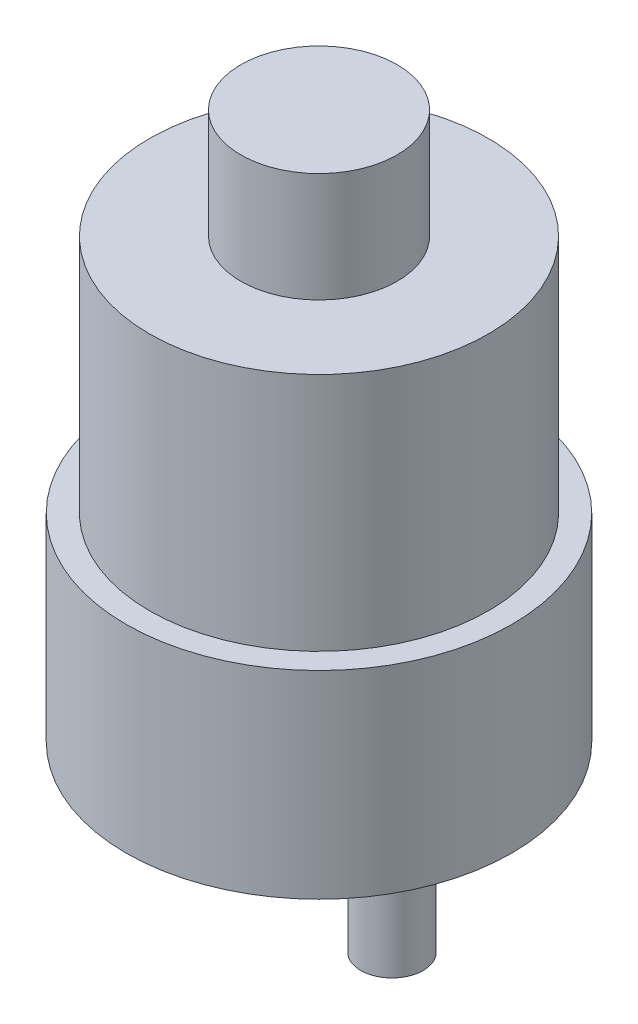
ISO-10303-21;
HEADER;
FILE_DESCRIPTION(('STEP AP214'),'2;1');
FILE_NAME('part.step','',(''),(''),'','','');
FILE_SCHEMA(('AUTOMOTIVE_DESIGN { 1 0 10303 214 1 1 1 1 }'));
ENDSEC;
DATA;
#1=APPLICATION_CONTEXT('core data for automotive mechanical design processes');
#2=APPLICATION_PROTOCOL_DEFINITION('international standard','automotive_design',2000,#1);
#3=PRODUCT_CONTEXT('',#1,'mechanical');
#4=PRODUCT('Part','Part','',(#3));
#5=PRODUCT_RELATED_PRODUCT_CATEGORY('part','',(#4));
#6=PRODUCT_DEFINITION_FORMATION('','',#4);
#7=PRODUCT_DEFINITION_CONTEXT('part definition',#1,'design');
#8=PRODUCT_DEFINITION('design','',#6,#7);
#9=PRODUCT_DEFINITION_SHAPE('','',#8);
#10=(LENGTH_UNIT() NAMED_UNIT(*) SI_UNIT(.MILLI.,.METRE.));
#11=(NAMED_UNIT(*) PLANE_ANGLE_UNIT() SI_UNIT($,.RADIAN.));
#12=(NAMED_UNIT(*) SI_UNIT($,.STERADIAN.) SOLID_ANGLE_UNIT());
#13=UNCERTAINTY_MEASURE_WITH_UNIT(LENGTH_MEASURE(1.E-05),#10,'distance_accuracy_value','');
#14=(GEOMETRIC_REPRESENTATION_CONTEXT(3) GLOBAL_UNCERTAINTY_ASSIGNED_CONTEXT((#13)) GLOBAL_UNIT_ASSIGNED_CONTEXT((#10,
#11,#12)) REPRESENTATION_CONTEXT('',''));
#15=CARTESIAN_POINT('',(0.,0.,0.));
#16=DIRECTION('',(0.,0.,1.));
#17=DIRECTION('',(1.,0.,0.));
#18=AXIS2_PLACEMENT_3D('',#15,#16,#17);
#19=CARTESIAN_POINT('',(0.,19.,0.));
#20=DIRECTION('',(0.,-1.,0.));
#21=DIRECTION('',(0.,0.,-1.));
#22=AXIS2_PLACEMENT_3D('',#19,#20,#21);
#23=CYLINDRICAL_SURFACE('',#22,18.5);
#24=CARTESIAN_POINT('',(0.,19.,0.));
#25=DIRECTION('',(0.,1.,0.));
#26=DIRECTION('',(0.,0.,1.));
#27=AXIS2_PLACEMENT_3D('',#24,#25,#26);
#28=CIRCLE('',#27,18.5);
#29=CARTESIAN_POINT('',(0.,19.,18.5));
#30=VERTEX_POINT('',#29);
#31=EDGE_CURVE('E95',#30,#30,#28,.T.);
#32=ORIENTED_EDGE('',*,*,#31,.F.);
#33=EDGE_LOOP('',(#32));
#34=FACE_BOUND('',#33,.T.);
#35=CARTESIAN_POINT('',(0.,0.,0.));
#36=DIRECTION('',(0.,1.,0.));
#37=DIRECTION('',(0.,0.,1.));
#38=AXIS2_PLACEMENT_3D('',#35,#36,#37);
#39=CIRCLE('',#38,18.5);
#40=CARTESIAN_POINT('',(0.,0.,18.5));
#41=VERTEX_POINT('',#40);
#42=EDGE_CURVE('E92',#41,#41,#39,.T.);
#43=ORIENTED_EDGE('',*,*,#42,.T.);
#44=EDGE_LOOP('',(#43));
#45=FACE_BOUND('',#44,.T.);
#46=ADVANCED_FACE('F37',(#34,#45),#23,.T.);
#47=CARTESIAN_POINT('',(0.,19.,0.));
#48=DIRECTION('',(0.,1.,0.));
#49=DIRECTION('',(0.,0.,1.));
#50=AXIS2_PLACEMENT_3D('',#47,#48,#49);
#51=PLANE('',#50);
#52=CARTESIAN_POINT('',(0.,19.,0.));
#53=DIRECTION('',(0.,1.,0.));
#54=DIRECTION('',(0.,0.,1.));
#55=AXIS2_PLACEMENT_3D('',#52,#53,#54);
#56=CIRCLE('',#55,16.25);
#57=CARTESIAN_POINT('',(0.,19.,16.25));
#58=VERTEX_POINT('',#57);
#59=EDGE_CURVE('E45',#58,#58,#56,.T.);
#60=ORIENTED_EDGE('',*,*,#59,.F.);
#61=EDGE_LOOP('',(#60));
#62=FACE_BOUND('',#61,.T.);
#63=ORIENTED_EDGE('',*,*,#31,.T.);
#64=EDGE_LOOP('',(#63));
#65=FACE_BOUND('',#64,.T.);
#66=ADVANCED_FACE('F156',(#62,#65),#51,.T.);
#67=CARTESIAN_POINT('',(0.,0.,0.));
#68=DIRECTION('',(0.,1.,0.));
#69=DIRECTION('',(0.,0.,1.));
#70=AXIS2_PLACEMENT_3D('',#67,#68,#69);
#71=PLANE('',#70);
#72=CARTESIAN_POINT('',(15.5,0.,0.));
#73=DIRECTION('',(0.,1.,0.));
#74=DIRECTION('',(0.,0.,1.));
#75=AXIS2_PLACEMENT_3D('',#72,#73,#74);
#76=CIRCLE('',#75,1.36510364534446);
#77=CARTESIAN_POINT('',(15.5,0.,1.36510364534446));
#78=VERTEX_POINT('',#77);
#79=EDGE_CURVE('E81',#78,#78,#76,.T.);
#80=ORIENTED_EDGE('',*,*,#79,.T.);
#81=EDGE_LOOP('',(#80));
#82=FACE_BOUND('',#81,.T.);
#83=CARTESIAN_POINT('',(7.75,0.,-13.4233937586588));
#84=DIRECTION('',(0.,1.,0.));
#85=DIRECTION('',(0.,0.,1.));
#86=AXIS2_PLACEMENT_3D('',#83,#84,#85);
#87=CIRCLE('',#86,1.36510364534446);
#88=CARTESIAN_POINT('',(7.75,0.,-12.0582901133143));
#89=VERTEX_POINT('',#88);
#90=EDGE_CURVE('E109',#89,#89,#87,.T.);
#91=ORIENTED_EDGE('',*,*,#90,.T.);
#92=EDGE_LOOP('',(#91));
#93=FACE_BOUND('',#92,.T.);
#94=CARTESIAN_POINT('',(-7.75,0.,-13.4233937586588));
#95=DIRECTION('',(0.,1.,0.));
#96=DIRECTION('',(0.,0.,1.));
#97=AXIS2_PLACEMENT_3D('',#94,#95,#96);
#98=CIRCLE('',#97,1.36510364534446);
#99=CARTESIAN_POINT('',(-7.75,0.,-12.0582901133143));
#100=VERTEX_POINT('',#99);
#101=EDGE_CURVE('E131',#100,#100,#98,.T.);
#102=ORIENTED_EDGE('',*,*,#101,.T.);
#103=EDGE_LOOP('',(#102));
#104=FACE_BOUND('',#103,.T.);
#105=CARTESIAN_POINT('',(-15.5,0.,0.));
#106=DIRECTION('',(0.,1.,0.));
#107=DIRECTION('',(0.,0.,1.));
#108=AXIS2_PLACEMENT_3D('',#105,#106,#107);
#109=CIRCLE('',#108,1.36510364534447);
#110=CARTESIAN_POINT('',(-15.5,0.,1.36510364534447));
#111=VERTEX_POINT('',#110);
#112=EDGE_CURVE('E126',#111,#111,#109,.T.);
#113=ORIENTED_EDGE('',*,*,#112,.T.);
#114=EDGE_LOOP('',(#113));
#115=FACE_BOUND('',#114,.T.);
#116=CARTESIAN_POINT('',(-7.74999999999999,0.,13.4233937586588));
#117=DIRECTION('',(0.,1.,0.));
#118=DIRECTION('',(0.,0.,1.));
#119=AXIS2_PLACEMENT_3D('',#116,#117,#118);
#120=CIRCLE('',#119,1.36510364534447);
#121=CARTESIAN_POINT('',(-7.74999999999999,0.,14.7884974040033));
#122=VERTEX_POINT('',#121);
#123=EDGE_CURVE('E120',#122,#122,#120,.T.);
#124=ORIENTED_EDGE('',*,*,#123,.T.);
#125=EDGE_LOOP('',(#124));
#126=FACE_BOUND('',#125,.T.);
#127=CARTESIAN_POINT('',(7.75000000000001,0.,13.4233937586588));
#128=DIRECTION('',(0.,1.,0.));
#129=DIRECTION('',(0.,0.,1.));
#130=AXIS2_PLACEMENT_3D('',#127,#128,#129);
#131=CIRCLE('',#130,1.36510364534447);
#132=CARTESIAN_POINT('',(7.75000000000001,0.,14.7884974040033));
#133=VERTEX_POINT('',#132);
#134=EDGE_CURVE('E108',#133,#133,#131,.T.);
#135=ORIENTED_EDGE('',*,*,#134,.T.);
#136=EDGE_LOOP('',(#135));
#137=FACE_BOUND('',#136,.T.);
#138=CARTESIAN_POINT('',(0.,0.,-7.));
#139=DIRECTION('',(0.,1.,0.));
#140=DIRECTION('',(0.,0.,1.));
#141=AXIS2_PLACEMENT_3D('',#138,#139,#140);
#142=CIRCLE('',#141,6.);
#143=CARTESIAN_POINT('',(0.,0.,-0.999999999999999));
#144=VERTEX_POINT('',#143);
#145=EDGE_CURVE('E87',#144,#144,#142,.T.);
#146=ORIENTED_EDGE('',*,*,#145,.T.);
#147=EDGE_LOOP('',(#146));
#148=FACE_BOUND('',#147,.T.);
#149=ORIENTED_EDGE('',*,*,#42,.F.);
#150=EDGE_LOOP('',(#149));
#151=FACE_BOUND('',#150,.T.);
#152=ADVANCED_FACE('F161',(#82,#93,#104,#115,#126,#137,#148,#151),#71,.F.);
#153=CARTESIAN_POINT('',(0.,-6.,-7.));
#154=DIRECTION('',(0.,1.,0.));
#155=DIRECTION('',(0.,0.,1.));
#156=AXIS2_PLACEMENT_3D('',#153,#154,#155);
#157=CYLINDRICAL_SURFACE('',#156,6.);
#158=CARTESIAN_POINT('',(0.,-6.,-7.));
#159=DIRECTION('',(0.,1.,0.));
#160=DIRECTION('',(0.,0.,1.));
#161=AXIS2_PLACEMENT_3D('',#158,#159,#160);
#162=CIRCLE('',#161,6.);
#163=CARTESIAN_POINT('',(0.,-6.,-0.999999999999999));
#164=VERTEX_POINT('',#163);
#165=EDGE_CURVE('E89',#164,#164,#162,.T.);
#166=ORIENTED_EDGE('',*,*,#165,.T.);
#167=EDGE_LOOP('',(#166));
#168=FACE_BOUND('',#167,.T.);
#169=ORIENTED_EDGE('',*,*,#145,.F.);
#170=EDGE_LOOP('',(#169));
#171=FACE_BOUND('',#170,.T.);
#172=ADVANCED_FACE('F169',(#168,#171),#157,.T.);
#173=CARTESIAN_POINT('',(0.,-6.,0.));
#174=DIRECTION('',(0.,1.,0.));
#175=DIRECTION('',(0.,0.,1.));
#176=AXIS2_PLACEMENT_3D('',#173,#174,#175);
#177=PLANE('',#176);
#178=DIRECTION('',(1.,0.,0.));
#179=VECTOR('',#178,1.);
#180=CARTESIAN_POINT('',(0.,-6.,-9.));
#181=LINE('',#180,#179);
#182=CARTESIAN_POINT('',(-2.23606797749979,-6.,-9.));
#183=VERTEX_POINT('',#182);
#184=CARTESIAN_POINT('',(2.23606797749979,-6.,-9.));
#185=VERTEX_POINT('',#184);
#186=EDGE_CURVE('E52',#183,#185,#181,.T.);
#187=ORIENTED_EDGE('',*,*,#186,.F.);
#188=CARTESIAN_POINT('',(0.,-6.,-7.));
#189=DIRECTION('',(0.,1.,0.));
#190=DIRECTION('',(0.,0.,1.));
#191=AXIS2_PLACEMENT_3D('',#188,#189,#190);
#192=CIRCLE('',#191,3.);
#193=EDGE_CURVE('E40',#183,#185,#192,.T.);
#194=ORIENTED_EDGE('',*,*,#193,.T.);
#195=EDGE_LOOP('',(#187,#194));
#196=FACE_BOUND('',#195,.T.);
#197=ORIENTED_EDGE('',*,*,#165,.F.);
#198=EDGE_LOOP('',(#197));
#199=FACE_BOUND('',#198,.T.);
#200=ADVANCED_FACE('F174',(#196,#199),#177,.F.);
#201=CARTESIAN_POINT('',(0.,-21.,-7.));
#202=DIRECTION('',(0.,1.,0.));
#203=DIRECTION('',(0.,0.,1.));
#204=AXIS2_PLACEMENT_3D('',#201,#202,#203);
#205=CYLINDRICAL_SURFACE('',#204,3.);
#206=ORIENTED_EDGE('',*,*,#193,.F.);
#207=DIRECTION('',(0.,1.,0.));
#208=VECTOR('',#207,1.);
#209=CARTESIAN_POINT('',(-2.23606797749979,-21.,-9.));
#210=LINE('',#209,#208);
#211=CARTESIAN_POINT('',(-2.23606797749979,-21.,-9.));
#212=VERTEX_POINT('',#211);
#213=EDGE_CURVE('E75',#212,#183,#210,.T.);
#214=ORIENTED_EDGE('',*,*,#213,.F.);
#215=CARTESIAN_POINT('',(0.,-21.,-7.));
#216=DIRECTION('',(0.,1.,0.));
#217=DIRECTION('',(0.,0.,1.));
#218=AXIS2_PLACEMENT_3D('',#215,#216,#217);
#219=CIRCLE('',#218,3.);
#220=CARTESIAN_POINT('',(2.23606797749979,-21.,-9.));
#221=VERTEX_POINT('',#220);
#222=EDGE_CURVE('E67',#212,#221,#219,.T.);
#223=ORIENTED_EDGE('',*,*,#222,.T.);
#224=DIRECTION('',(0.,1.,0.));
#225=VECTOR('',#224,1.);
#226=CARTESIAN_POINT('',(2.23606797749979,-21.,-9.));
#227=LINE('',#226,#225);
#228=EDGE_CURVE('E70',#221,#185,#227,.T.);
#229=ORIENTED_EDGE('',*,*,#228,.T.);
#230=EDGE_LOOP('',(#206,#214,#223,#229));
#231=FACE_BOUND('',#230,.T.);
#232=ADVANCED_FACE('F77',(#231),#205,.T.);
#233=CARTESIAN_POINT('',(-2.23606797749979,-21.,-9.));
#234=DIRECTION('',(0.,0.,1.));
#235=DIRECTION('',(1.,0.,0.));
#236=AXIS2_PLACEMENT_3D('',#233,#234,#235);
#237=PLANE('',#236);
#238=ORIENTED_EDGE('',*,*,#213,.T.);
#239=ORIENTED_EDGE('',*,*,#186,.T.);
#240=ORIENTED_EDGE('',*,*,#228,.F.);
#241=DIRECTION('',(1.,0.,0.));
#242=VECTOR('',#241,1.);
#243=CARTESIAN_POINT('',(-2.23606797749979,-21.,-9.));
#244=LINE('',#243,#242);
#245=EDGE_CURVE('E63',#212,#221,#244,.T.);
#246=ORIENTED_EDGE('',*,*,#245,.F.);
#247=EDGE_LOOP('',(#238,#239,#240,#246));
#248=FACE_BOUND('',#247,.T.);
#249=ADVANCED_FACE('F73',(#248),#237,.F.);
#250=CARTESIAN_POINT('',(0.,-21.,-7.));
#251=DIRECTION('',(0.,1.,0.));
#252=DIRECTION('',(0.,0.,1.));
#253=AXIS2_PLACEMENT_3D('',#250,#251,#252);
#254=PLANE('',#253);
#255=ORIENTED_EDGE('',*,*,#222,.F.);
#256=ORIENTED_EDGE('',*,*,#245,.T.);
#257=EDGE_LOOP('',(#255,#256));
#258=FACE_BOUND('',#257,.T.);
#259=ADVANCED_FACE('F65',(#258),#254,.F.);
#260=CARTESIAN_POINT('',(7.75000000000001,6.,13.4233937586588));
#261=DIRECTION('',(0.,-1.,0.));
#262=DIRECTION('',(0.,0.,-1.));
#263=AXIS2_PLACEMENT_3D('',#260,#261,#262);
#264=CYLINDRICAL_SURFACE('',#263,1.36510364534447);
#265=CARTESIAN_POINT('',(7.75000000000001,6.,13.4233937586588));
#266=DIRECTION('',(0.,1.,0.));
#267=DIRECTION('',(0.,0.,1.));
#268=AXIS2_PLACEMENT_3D('',#265,#266,#267);
#269=CIRCLE('',#268,1.36510364534447);
#270=CARTESIAN_POINT('',(7.75000000000001,6.,14.7884974040033));
#271=VERTEX_POINT('',#270);
#272=EDGE_CURVE('E117',#271,#271,#269,.T.);
#273=ORIENTED_EDGE('',*,*,#272,.T.);
#274=EDGE_LOOP('',(#273));
#275=FACE_BOUND('',#274,.T.);
#276=ORIENTED_EDGE('',*,*,#134,.F.);
#277=EDGE_LOOP('',(#276));
#278=FACE_BOUND('',#277,.T.);
#279=ADVANCED_FACE('F185',(#275,#278),#264,.F.);
#280=CARTESIAN_POINT('',(7.75000000000001,6.,13.4233937586588));
#281=DIRECTION('',(0.,1.,0.));
#282=DIRECTION('',(0.,0.,1.));
#283=AXIS2_PLACEMENT_3D('',#280,#281,#282);
#284=PLANE('',#283);
#285=ORIENTED_EDGE('',*,*,#272,.F.);
#286=EDGE_LOOP('',(#285));
#287=FACE_BOUND('',#286,.T.);
#288=ADVANCED_FACE('F189',(#287),#284,.F.);
#289=CARTESIAN_POINT('',(-7.74999999999999,6.,13.4233937586588));
#290=DIRECTION('',(0.,-1.,0.));
#291=DIRECTION('',(0.,0.,-1.));
#292=AXIS2_PLACEMENT_3D('',#289,#290,#291);
#293=CYLINDRICAL_SURFACE('',#292,1.36510364534447);
#294=CARTESIAN_POINT('',(-7.74999999999999,6.,13.4233937586588));
#295=DIRECTION('',(0.,1.,0.));
#296=DIRECTION('',(0.,0.,1.));
#297=AXIS2_PLACEMENT_3D('',#294,#295,#296);
#298=CIRCLE('',#297,1.36510364534447);
#299=CARTESIAN_POINT('',(-7.74999999999999,6.,14.7884974040033));
#300=VERTEX_POINT('',#299);
#301=EDGE_CURVE('E123',#300,#300,#298,.T.);
#302=ORIENTED_EDGE('',*,*,#301,.T.);
#303=EDGE_LOOP('',(#302));
#304=FACE_BOUND('',#303,.T.);
#305=ORIENTED_EDGE('',*,*,#123,.F.);
#306=EDGE_LOOP('',(#305));
#307=FACE_BOUND('',#306,.T.);
#308=ADVANCED_FACE('F195',(#304,#307),#293,.F.);
#309=CARTESIAN_POINT('',(-7.74999999999999,6.,13.4233937586588));
#310=DIRECTION('',(0.,1.,0.));
#311=DIRECTION('',(0.,0.,1.));
#312=AXIS2_PLACEMENT_3D('',#309,#310,#311);
#313=PLANE('',#312);
#314=ORIENTED_EDGE('',*,*,#301,.F.);
#315=EDGE_LOOP('',(#314));
#316=FACE_BOUND('',#315,.T.);
#317=ADVANCED_FACE('F203',(#316),#313,.F.);
#318=CARTESIAN_POINT('',(-15.5,6.,0.));
#319=DIRECTION('',(0.,-1.,0.));
#320=DIRECTION('',(0.,0.,-1.));
#321=AXIS2_PLACEMENT_3D('',#318,#319,#320);
#322=CYLINDRICAL_SURFACE('',#321,1.36510364534447);
#323=CARTESIAN_POINT('',(-15.5,6.,0.));
#324=DIRECTION('',(0.,1.,0.));
#325=DIRECTION('',(0.,0.,1.));
#326=AXIS2_PLACEMENT_3D('',#323,#324,#325);
#327=CIRCLE('',#326,1.36510364534447);
#328=CARTESIAN_POINT('',(-15.5,6.,1.36510364534447));
#329=VERTEX_POINT('',#328);
#330=EDGE_CURVE('E129',#329,#329,#327,.T.);
#331=ORIENTED_EDGE('',*,*,#330,.T.);
#332=EDGE_LOOP('',(#331));
#333=FACE_BOUND('',#332,.T.);
#334=ORIENTED_EDGE('',*,*,#112,.F.);
#335=EDGE_LOOP('',(#334));
#336=FACE_BOUND('',#335,.T.);
#337=ADVANCED_FACE('F207',(#333,#336),#322,.F.);
#338=CARTESIAN_POINT('',(-15.5,6.,0.));
#339=DIRECTION('',(0.,1.,0.));
#340=DIRECTION('',(0.,0.,1.));
#341=AXIS2_PLACEMENT_3D('',#338,#339,#340);
#342=PLANE('',#341);
#343=ORIENTED_EDGE('',*,*,#330,.F.);
#344=EDGE_LOOP('',(#343));
#345=FACE_BOUND('',#344,.T.);
#346=ADVANCED_FACE('F152',(#345),#342,.F.);
#347=CARTESIAN_POINT('',(-7.75,6.,-13.4233937586588));
#348=DIRECTION('',(0.,-1.,0.));
#349=DIRECTION('',(0.,0.,-1.));
#350=AXIS2_PLACEMENT_3D('',#347,#348,#349);
#351=CYLINDRICAL_SURFACE('',#350,1.36510364534446);
#352=CARTESIAN_POINT('',(-7.75,6.,-13.4233937586588));
#353=DIRECTION('',(0.,1.,0.));
#354=DIRECTION('',(0.,0.,1.));
#355=AXIS2_PLACEMENT_3D('',#352,#353,#354);
#356=CIRCLE('',#355,1.36510364534446);
#357=CARTESIAN_POINT('',(-7.75,6.,-12.0582901133143));
#358=VERTEX_POINT('',#357);
#359=EDGE_CURVE('E84',#358,#358,#356,.T.);
#360=ORIENTED_EDGE('',*,*,#359,.T.);
#361=EDGE_LOOP('',(#360));
#362=FACE_BOUND('',#361,.T.);
#363=ORIENTED_EDGE('',*,*,#101,.F.);
#364=EDGE_LOOP('',(#363));
#365=FACE_BOUND('',#364,.T.);
#366=ADVANCED_FACE('F138',(#362,#365),#351,.F.);
#367=CARTESIAN_POINT('',(-7.75,6.,-13.4233937586588));
#368=DIRECTION('',(0.,1.,0.));
#369=DIRECTION('',(0.,0.,1.));
#370=AXIS2_PLACEMENT_3D('',#367,#368,#369);
#371=PLANE('',#370);
#372=ORIENTED_EDGE('',*,*,#359,.F.);
#373=EDGE_LOOP('',(#372));
#374=FACE_BOUND('',#373,.T.);
#375=ADVANCED_FACE('F141',(#374),#371,.F.);
#376=CARTESIAN_POINT('',(7.75,6.,-13.4233937586588));
#377=DIRECTION('',(0.,-1.,0.));
#378=DIRECTION('',(0.,0.,-1.));
#379=AXIS2_PLACEMENT_3D('',#376,#377,#378);
#380=CYLINDRICAL_SURFACE('',#379,1.36510364534446);
#381=CARTESIAN_POINT('',(7.75,6.,-13.4233937586588));
#382=DIRECTION('',(0.,1.,0.));
#383=DIRECTION('',(0.,0.,1.));
#384=AXIS2_PLACEMENT_3D('',#381,#382,#383);
#385=CIRCLE('',#384,1.36510364534446);
#386=CARTESIAN_POINT('',(7.75,6.,-12.0582901133143));
#387=VERTEX_POINT('',#386);
#388=EDGE_CURVE('E112',#387,#387,#385,.T.);
#389=ORIENTED_EDGE('',*,*,#388,.T.);
#390=EDGE_LOOP('',(#389));
#391=FACE_BOUND('',#390,.T.);
#392=ORIENTED_EDGE('',*,*,#90,.F.);
#393=EDGE_LOOP('',(#392));
#394=FACE_BOUND('',#393,.T.);
#395=ADVANCED_FACE('F143',(#391,#394),#380,.F.);
#396=CARTESIAN_POINT('',(7.75,6.,-13.4233937586588));
#397=DIRECTION('',(0.,1.,0.));
#398=DIRECTION('',(0.,0.,1.));
#399=AXIS2_PLACEMENT_3D('',#396,#397,#398);
#400=PLANE('',#399);
#401=ORIENTED_EDGE('',*,*,#388,.F.);
#402=EDGE_LOOP('',(#401));
#403=FACE_BOUND('',#402,.T.);
#404=ADVANCED_FACE('F149',(#403),#400,.F.);
#405=CARTESIAN_POINT('',(15.5,6.,0.));
#406=DIRECTION('',(0.,-1.,0.));
#407=DIRECTION('',(0.,0.,-1.));
#408=AXIS2_PLACEMENT_3D('',#405,#406,#407);
#409=CYLINDRICAL_SURFACE('',#408,1.36510364534446);
#410=CARTESIAN_POINT('',(15.5,6.,0.));
#411=DIRECTION('',(0.,1.,0.));
#412=DIRECTION('',(0.,0.,1.));
#413=AXIS2_PLACEMENT_3D('',#410,#411,#412);
#414=CIRCLE('',#413,1.36510364534446);
#415=CARTESIAN_POINT('',(15.5,6.,1.36510364534446));
#416=VERTEX_POINT('',#415);
#417=EDGE_CURVE('E78',#416,#416,#414,.T.);
#418=ORIENTED_EDGE('',*,*,#417,.T.);
#419=EDGE_LOOP('',(#418));
#420=FACE_BOUND('',#419,.T.);
#421=ORIENTED_EDGE('',*,*,#79,.F.);
#422=EDGE_LOOP('',(#421));
#423=FACE_BOUND('',#422,.T.);
#424=ADVANCED_FACE('F253',(#420,#423),#409,.F.);
#425=CARTESIAN_POINT('',(15.5,6.,0.));
#426=DIRECTION('',(0.,1.,0.));
#427=DIRECTION('',(0.,0.,1.));
#428=AXIS2_PLACEMENT_3D('',#425,#426,#427);
#429=PLANE('',#428);
#430=ORIENTED_EDGE('',*,*,#417,.F.);
#431=EDGE_LOOP('',(#430));
#432=FACE_BOUND('',#431,.T.);
#433=ADVANCED_FACE('F262',(#432),#429,.F.);
#434=CARTESIAN_POINT('',(0.,42.,0.));
#435=DIRECTION('',(0.,-1.,0.));
#436=DIRECTION('',(0.,0.,-1.));
#437=AXIS2_PLACEMENT_3D('',#434,#435,#436);
#438=CYLINDRICAL_SURFACE('',#437,16.25);
#439=CARTESIAN_POINT('',(0.,42.,0.));
#440=DIRECTION('',(0.,1.,0.));
#441=DIRECTION('',(0.,0.,1.));
#442=AXIS2_PLACEMENT_3D('',#439,#440,#441);
#443=CIRCLE('',#442,16.25);
#444=CARTESIAN_POINT('',(0.,42.,16.25));
#445=VERTEX_POINT('',#444);
#446=EDGE_CURVE('E104',#445,#445,#443,.T.);
#447=ORIENTED_EDGE('',*,*,#446,.F.);
#448=EDGE_LOOP('',(#447));
#449=FACE_BOUND('',#448,.T.);
#450=ORIENTED_EDGE('',*,*,#59,.T.);
#451=EDGE_LOOP('',(#450));
#452=FACE_BOUND('',#451,.T.);
#453=ADVANCED_FACE('F272',(#449,#452),#438,.T.);
#454=CARTESIAN_POINT('',(0.,42.,0.));
#455=DIRECTION('',(0.,1.,0.));
#456=DIRECTION('',(0.,0.,1.));
#457=AXIS2_PLACEMENT_3D('',#454,#455,#456);
#458=PLANE('',#457);
#459=CARTESIAN_POINT('',(0.,42.,0.));
#460=DIRECTION('',(0.,1.,0.));
#461=DIRECTION('',(0.,0.,1.));
#462=AXIS2_PLACEMENT_3D('',#459,#460,#461);
#463=CIRCLE('',#462,7.5);
#464=CARTESIAN_POINT('',(0.,42.,-7.5));
#465=VERTEX_POINT('',#464);
#466=EDGE_CURVE('E11',#465,#465,#463,.T.);
#467=ORIENTED_EDGE('',*,*,#466,.F.);
#468=EDGE_LOOP('',(#467));
#469=FACE_BOUND('',#468,.T.);
#470=ORIENTED_EDGE('',*,*,#446,.T.);
#471=EDGE_LOOP('',(#470));
#472=FACE_BOUND('',#471,.T.);
#473=ADVANCED_FACE('F291',(#469,#472),#458,.T.);
#474=CARTESIAN_POINT('',(0.,52.5,0.));
#475=DIRECTION('',(0.,-1.,0.));
#476=DIRECTION('',(0.,0.,-1.));
#477=AXIS2_PLACEMENT_3D('',#474,#475,#476);
#478=CYLINDRICAL_SURFACE('',#477,7.5);
#479=CARTESIAN_POINT('',(0.,52.5,0.));
#480=DIRECTION('',(0.,1.,0.));
#481=DIRECTION('',(0.,0.,1.));
#482=AXIS2_PLACEMENT_3D('',#479,#480,#481);
#483=CIRCLE('',#482,7.5);
#484=CARTESIAN_POINT('',(0.,52.5,-7.5));
#485=VERTEX_POINT('',#484);
#486=EDGE_CURVE('E327',#485,#485,#483,.T.);
#487=CARTESIAN_POINT('',(0.,52.5,-7.5));
#488=CARTESIAN_POINT('',(0.,52.390625,-7.5));
#489=CARTESIAN_POINT('',(0.,52.28125,-7.5));
#490=CARTESIAN_POINT('',(0.,52.0625,-7.5));
#491=CARTESIAN_POINT('',(0.,51.953125,-7.5));
#492=CARTESIAN_POINT('',(0.,51.734375,-7.5));
#493=CARTESIAN_POINT('',(0.,51.625,-7.5));
#494=CARTESIAN_POINT('',(0.,51.40625,-7.5));
#495=CARTESIAN_POINT('',(0.,51.296875,-7.5));
#496=CARTESIAN_POINT('',(0.,51.078125,-7.5));
#497=CARTESIAN_POINT('',(0.,50.96875,-7.5));
#498=CARTESIAN_POINT('',(0.,50.75,-7.5));
#499=CARTESIAN_POINT('',(0.,50.640625,-7.5));
#500=CARTESIAN_POINT('',(0.,50.421875,-7.5));
#501=CARTESIAN_POINT('',(0.,50.3125,-7.5));
#502=CARTESIAN_POINT('',(0.,50.09375,-7.5));
#503=CARTESIAN_POINT('',(0.,49.984375,-7.5));
#504=CARTESIAN_POINT('',(0.,49.765625,-7.5));
#505=CARTESIAN_POINT('',(0.,49.65625,-7.5));
#506=CARTESIAN_POINT('',(0.,49.4375,-7.5));
#507=CARTESIAN_POINT('',(0.,49.328125,-7.5));
#508=CARTESIAN_POINT('',(0.,49.109375,-7.5));
#509=CARTESIAN_POINT('',(0.,49.,-7.5));
#510=CARTESIAN_POINT('',(0.,48.78125,-7.5));
#511=CARTESIAN_POINT('',(0.,48.671875,-7.5));
#512=CARTESIAN_POINT('',(0.,48.453125,-7.5));
#513=CARTESIAN_POINT('',(0.,48.34375,-7.5));
#514=CARTESIAN_POINT('',(0.,48.125,-7.5));
#515=CARTESIAN_POINT('',(0.,48.015625,-7.5));
#516=CARTESIAN_POINT('',(0.,47.796875,-7.5));
#517=CARTESIAN_POINT('',(0.,47.6875,-7.5));
#518=CARTESIAN_POINT('',(0.,47.46875,-7.5));
#519=CARTESIAN_POINT('',(0.,47.359375,-7.5));
#520=CARTESIAN_POINT('',(0.,47.140625,-7.5));
#521=CARTESIAN_POINT('',(0.,47.03125,-7.5));
#522=CARTESIAN_POINT('',(0.,46.8125,-7.5));
#523=CARTESIAN_POINT('',(0.,46.703125,-7.5));
#524=CARTESIAN_POINT('',(0.,46.484375,-7.5));
#525=CARTESIAN_POINT('',(0.,46.375,-7.5));
#526=CARTESIAN_POINT('',(0.,46.15625,-7.5));
#527=CARTESIAN_POINT('',(0.,46.046875,-7.5));
#528=CARTESIAN_POINT('',(0.,45.828125,-7.5));
#529=CARTESIAN_POINT('',(0.,45.71875,-7.5));
#530=CARTESIAN_POINT('',(0.,45.5,-7.5));
#531=CARTESIAN_POINT('',(0.,45.390625,-7.5));
#532=CARTESIAN_POINT('',(0.,45.171875,-7.5));
#533=CARTESIAN_POINT('',(0.,45.0625,-7.5));
#534=CARTESIAN_POINT('',(0.,44.84375,-7.5));
#535=CARTESIAN_POINT('',(0.,44.734375,-7.5));
#536=CARTESIAN_POINT('',(0.,44.515625,-7.5));
#537=CARTESIAN_POINT('',(0.,44.40625,-7.5));
#538=CARTESIAN_POINT('',(0.,44.1875,-7.5));
#539=CARTESIAN_POINT('',(0.,44.078125,-7.5));
#540=CARTESIAN_POINT('',(0.,43.859375,-7.5));
#541=CARTESIAN_POINT('',(0.,43.75,-7.5));
#542=CARTESIAN_POINT('',(0.,43.53125,-7.5));
#543=CARTESIAN_POINT('',(0.,43.421875,-7.5));
#544=CARTESIAN_POINT('',(0.,43.203125,-7.5));
#545=CARTESIAN_POINT('',(0.,43.09375,-7.5));
#546=CARTESIAN_POINT('',(0.,42.875,-7.5));
#547=CARTESIAN_POINT('',(0.,42.765625,-7.5));
#548=CARTESIAN_POINT('',(0.,42.546875,-7.5));
#549=CARTESIAN_POINT('',(0.,42.4375,-7.5));
#550=CARTESIAN_POINT('',(0.,42.21875,-7.5));
#551=CARTESIAN_POINT('',(0.,42.109375,-7.5));
#552=CARTESIAN_POINT('',(0.,42.,-7.5));
#553=B_SPLINE_CURVE_WITH_KNOTS('',3,(#487,#488,#489,#490,#491,#492,#493,#494,#495,#496,#497,
#498,#499,#500,#501,#502,#503,#504,#505,#506,#507,#508,#509,#510,#511,#512,#513,#514,#515,#516,
#517,#518,#519,#520,#521,#522,#523,#524,#525,#526,#527,#528,#529,#530,#531,#532,#533,#534,#535,
#536,#537,#538,#539,#540,#541,#542,#543,#544,#545,#546,#547,#548,#549,#550,#551,#552),
.UNSPECIFIED.,.F.,.F.,(4,2,2,2,2,2,2,2,2,2,2,2,2,2,2,2,2,2,2,2,2,2,2,2,2,2,2,2,2,2,2,2,4),(0.,
0.328125000000005,0.656250000000004,0.984375000000003,1.3125,1.64062500000001,1.96875000000001,
2.296875,2.625,2.95312500000001,3.28125000000001,3.609375,3.9375,4.265625,4.59375000000001,
4.92187500000001,5.25,5.578125,5.90625000000001,6.23437500000001,6.56250000000001,6.890625,
7.21875,7.54687500000001,7.87500000000001,8.20312500000001,8.53125,8.85937500000001,
9.18750000000001,9.51562500000001,9.84375000000001,10.171875,10.5),.UNSPECIFIED.);
#554=EDGE_CURVE('BSEAM301',#485,#465,#553,.T.);
#555=ORIENTED_EDGE('',*,*,#486,.F.);
#556=ORIENTED_EDGE('',*,*,#466,.T.);
#557=ORIENTED_EDGE('',*,*,#554,.T.);
#558=ORIENTED_EDGE('',*,*,#554,.F.);
#559=EDGE_LOOP('',(#555,#557,#556,#558));
#560=FACE_BOUND('',#559,.T.);
#561=ADVANCED_FACE('F301',(#560),#478,.T.);
#562=CARTESIAN_POINT('',(0.,52.5,0.));
#563=DIRECTION('',(0.,1.,0.));
#564=DIRECTION('',(0.,0.,1.));
#565=AXIS2_PLACEMENT_3D('',#562,#563,#564);
#566=PLANE('',#565);
#567=ORIENTED_EDGE('',*,*,#486,.T.);
#568=EDGE_LOOP('',(#567));
#569=FACE_BOUND('',#568,.T.);
#570=ADVANCED_FACE('F311',(#569),#566,.T.);
#571=CLOSED_SHELL('',(#46,#66,#152,#172,#200,#232,#249,#259,#279,#288,#308,#317,#337,#346,#366,
#375,#395,#404,#424,#433,#453,#473,#561,#570));
#572=MANIFOLD_SOLID_BREP('B2',#571);
#573=ADVANCED_BREP_SHAPE_REPRESENTATION('',(#18,#572),#14);
#574=SHAPE_DEFINITION_REPRESENTATION(#9,#573);
ENDSEC;
END-ISO-10303-21;
